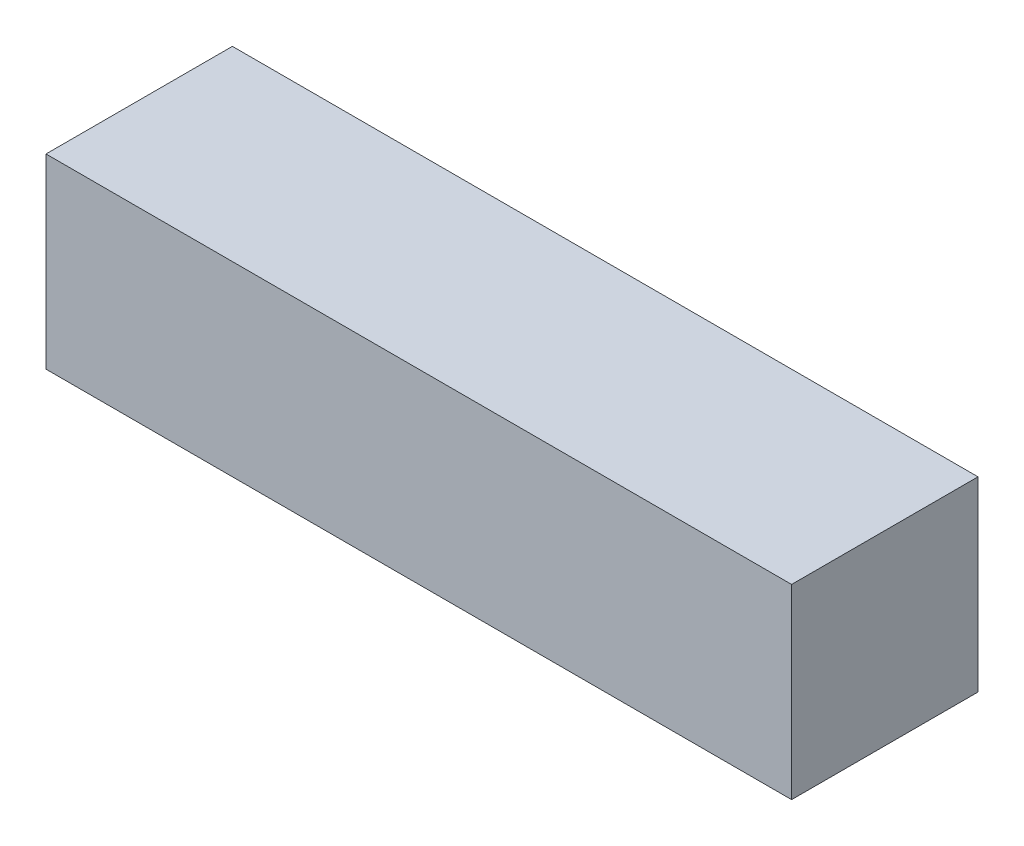
ISO-10303-21;
HEADER;
FILE_DESCRIPTION(('STEP AP214'),'2;1');
FILE_NAME('part.step','',(''),(''),'','','');
FILE_SCHEMA(('AUTOMOTIVE_DESIGN { 1 0 10303 214 1 1 1 1 }'));
ENDSEC;
DATA;
#1=APPLICATION_CONTEXT('core data for automotive mechanical design processes');
#2=APPLICATION_PROTOCOL_DEFINITION('international standard','automotive_design',2000,#1);
#3=PRODUCT_CONTEXT('',#1,'mechanical');
#4=PRODUCT('Part','Part','',(#3));
#5=PRODUCT_RELATED_PRODUCT_CATEGORY('part','',(#4));
#6=PRODUCT_DEFINITION_FORMATION('','',#4);
#7=PRODUCT_DEFINITION_CONTEXT('part definition',#1,'design');
#8=PRODUCT_DEFINITION('design','',#6,#7);
#9=PRODUCT_DEFINITION_SHAPE('','',#8);
#10=(LENGTH_UNIT() NAMED_UNIT(*) SI_UNIT(.MILLI.,.METRE.));
#11=(NAMED_UNIT(*) PLANE_ANGLE_UNIT() SI_UNIT($,.RADIAN.));
#12=(NAMED_UNIT(*) SI_UNIT($,.STERADIAN.) SOLID_ANGLE_UNIT());
#13=UNCERTAINTY_MEASURE_WITH_UNIT(LENGTH_MEASURE(1.E-05),#10,'distance_accuracy_value','');
#14=(GEOMETRIC_REPRESENTATION_CONTEXT(3) GLOBAL_UNCERTAINTY_ASSIGNED_CONTEXT((#13)) GLOBAL_UNIT_ASSIGNED_CONTEXT((#10,
#11,#12)) REPRESENTATION_CONTEXT('',''));
#15=CARTESIAN_POINT('',(0.,0.,0.));
#16=DIRECTION('',(0.,0.,1.));
#17=DIRECTION('',(1.,0.,0.));
#18=AXIS2_PLACEMENT_3D('',#15,#16,#17);
#19=CARTESIAN_POINT('',(400.,50.,50.));
#20=DIRECTION('',(0.,0.,-1.));
#21=DIRECTION('',(0.,1.,0.));
#22=AXIS2_PLACEMENT_3D('',#19,#20,#21);
#23=PLANE('',#22);
#24=DIRECTION('',(0.,-1.,0.));
#25=VECTOR('',#24,1.);
#26=CARTESIAN_POINT('',(0.,50.,50.));
#27=LINE('',#26,#25);
#28=CARTESIAN_POINT('',(0.,50.,50.));
#29=VERTEX_POINT('',#28);
#30=CARTESIAN_POINT('',(0.,-50.,50.));
#31=VERTEX_POINT('',#30);
#32=EDGE_CURVE('E99',#29,#31,#27,.T.);
#33=ORIENTED_EDGE('',*,*,#32,.T.);
#34=DIRECTION('',(-1.,0.,0.));
#35=VECTOR('',#34,1.);
#36=CARTESIAN_POINT('',(400.,-50.,50.));
#37=LINE('',#36,#35);
#38=CARTESIAN_POINT('',(400.,-50.,50.));
#39=VERTEX_POINT('',#38);
#40=EDGE_CURVE('E11',#39,#31,#37,.T.);
#41=ORIENTED_EDGE('',*,*,#40,.F.);
#42=DIRECTION('',(0.,-1.,0.));
#43=VECTOR('',#42,1.);
#44=CARTESIAN_POINT('',(400.,50.,50.));
#45=LINE('',#44,#43);
#46=CARTESIAN_POINT('',(400.,50.,50.));
#47=VERTEX_POINT('',#46);
#48=EDGE_CURVE('E87',#47,#39,#45,.T.);
#49=ORIENTED_EDGE('',*,*,#48,.F.);
#50=DIRECTION('',(-1.,0.,0.));
#51=VECTOR('',#50,1.);
#52=CARTESIAN_POINT('',(400.,50.,50.));
#53=LINE('',#52,#51);
#54=EDGE_CURVE('E95',#47,#29,#53,.T.);
#55=ORIENTED_EDGE('',*,*,#54,.T.);
#56=EDGE_LOOP('',(#33,#41,#49,#55));
#57=FACE_BOUND('',#56,.T.);
#58=ADVANCED_FACE('F36',(#57),#23,.F.);
#59=CARTESIAN_POINT('',(400.,-50.,50.));
#60=DIRECTION('',(0.,1.,0.));
#61=DIRECTION('',(0.,0.,1.));
#62=AXIS2_PLACEMENT_3D('',#59,#60,#61);
#63=PLANE('',#62);
#64=DIRECTION('',(0.,0.,-1.));
#65=VECTOR('',#64,1.);
#66=CARTESIAN_POINT('',(0.,-50.,50.));
#67=LINE('',#66,#65);
#68=CARTESIAN_POINT('',(0.,-50.,-50.));
#69=VERTEX_POINT('',#68);
#70=EDGE_CURVE('E91',#31,#69,#67,.T.);
#71=ORIENTED_EDGE('',*,*,#70,.T.);
#72=DIRECTION('',(-1.,0.,0.));
#73=VECTOR('',#72,1.);
#74=CARTESIAN_POINT('',(400.,-50.,-50.));
#75=LINE('',#74,#73);
#76=CARTESIAN_POINT('',(400.,-50.,-50.));
#77=VERTEX_POINT('',#76);
#78=EDGE_CURVE('E44',#77,#69,#75,.T.);
#79=ORIENTED_EDGE('',*,*,#78,.F.);
#80=DIRECTION('',(0.,0.,-1.));
#81=VECTOR('',#80,1.);
#82=CARTESIAN_POINT('',(400.,-50.,50.));
#83=LINE('',#82,#81);
#84=EDGE_CURVE('E82',#39,#77,#83,.T.);
#85=ORIENTED_EDGE('',*,*,#84,.F.);
#86=ORIENTED_EDGE('',*,*,#40,.T.);
#87=EDGE_LOOP('',(#71,#79,#85,#86));
#88=FACE_BOUND('',#87,.T.);
#89=ADVANCED_FACE('F90',(#88),#63,.F.);
#90=CARTESIAN_POINT('',(400.,50.,-50.));
#91=DIRECTION('',(0.,0.,1.));
#92=DIRECTION('',(0.,-1.,0.));
#93=AXIS2_PLACEMENT_3D('',#90,#91,#92);
#94=PLANE('',#93);
#95=DIRECTION('',(0.,1.,0.));
#96=VECTOR('',#95,1.);
#97=CARTESIAN_POINT('',(0.,50.,-50.));
#98=LINE('',#97,#96);
#99=CARTESIAN_POINT('',(0.,50.,-50.));
#100=VERTEX_POINT('',#99);
#101=EDGE_CURVE('E69',#69,#100,#98,.T.);
#102=ORIENTED_EDGE('',*,*,#101,.T.);
#103=DIRECTION('',(-1.,0.,0.));
#104=VECTOR('',#103,1.);
#105=CARTESIAN_POINT('',(400.,50.,-50.));
#106=LINE('',#105,#104);
#107=CARTESIAN_POINT('',(400.,50.,-50.));
#108=VERTEX_POINT('',#107);
#109=EDGE_CURVE('E92',#108,#100,#106,.T.);
#110=ORIENTED_EDGE('',*,*,#109,.F.);
#111=DIRECTION('',(0.,1.,0.));
#112=VECTOR('',#111,1.);
#113=CARTESIAN_POINT('',(400.,50.,-50.));
#114=LINE('',#113,#112);
#115=EDGE_CURVE('E85',#77,#108,#114,.T.);
#116=ORIENTED_EDGE('',*,*,#115,.F.);
#117=ORIENTED_EDGE('',*,*,#78,.T.);
#118=EDGE_LOOP('',(#102,#110,#116,#117));
#119=FACE_BOUND('',#118,.T.);
#120=ADVANCED_FACE('F93',(#119),#94,.F.);
#121=CARTESIAN_POINT('',(400.,50.,50.));
#122=DIRECTION('',(0.,-1.,0.));
#123=DIRECTION('',(0.,0.,-1.));
#124=AXIS2_PLACEMENT_3D('',#121,#122,#123);
#125=PLANE('',#124);
#126=DIRECTION('',(0.,0.,1.));
#127=VECTOR('',#126,1.);
#128=CARTESIAN_POINT('',(0.,50.,50.));
#129=LINE('',#128,#127);
#130=EDGE_CURVE('E75',#100,#29,#129,.T.);
#131=ORIENTED_EDGE('',*,*,#130,.T.);
#132=ORIENTED_EDGE('',*,*,#54,.F.);
#133=DIRECTION('',(0.,0.,1.));
#134=VECTOR('',#133,1.);
#135=CARTESIAN_POINT('',(400.,50.,50.));
#136=LINE('',#135,#134);
#137=EDGE_CURVE('E52',#108,#47,#136,.T.);
#138=ORIENTED_EDGE('',*,*,#137,.F.);
#139=ORIENTED_EDGE('',*,*,#109,.T.);
#140=EDGE_LOOP('',(#131,#132,#138,#139));
#141=FACE_BOUND('',#140,.T.);
#142=ADVANCED_FACE('F107',(#141),#125,.F.);
#143=CARTESIAN_POINT('',(400.,0.,0.));
#144=DIRECTION('',(1.,0.,0.));
#145=DIRECTION('',(0.,0.,-1.));
#146=AXIS2_PLACEMENT_3D('',#143,#144,#145);
#147=PLANE('',#146);
#148=ORIENTED_EDGE('',*,*,#48,.T.);
#149=ORIENTED_EDGE('',*,*,#84,.T.);
#150=ORIENTED_EDGE('',*,*,#115,.T.);
#151=ORIENTED_EDGE('',*,*,#137,.T.);
#152=EDGE_LOOP('',(#148,#149,#150,#151));
#153=FACE_BOUND('',#152,.T.);
#154=ADVANCED_FACE('F83',(#153),#147,.T.);
#155=CARTESIAN_POINT('',(0.,0.,0.));
#156=DIRECTION('',(1.,0.,0.));
#157=DIRECTION('',(0.,0.,-1.));
#158=AXIS2_PLACEMENT_3D('',#155,#156,#157);
#159=PLANE('',#158);
#160=CARTESIAN_POINT('',(0.,0.,0.));
#161=DIRECTION('',(-1.,0.,0.));
#162=DIRECTION('',(0.,0.,1.));
#163=AXIS2_PLACEMENT_3D('',#160,#161,#162);
#164=CIRCLE('',#163,4.);
#165=CARTESIAN_POINT('',(0.,0.,4.));
#166=VERTEX_POINT('',#165);
#167=EDGE_CURVE('E113',#166,#166,#164,.T.);
#168=ORIENTED_EDGE('',*,*,#167,.F.);
#169=EDGE_LOOP('',(#168));
#170=FACE_BOUND('',#169,.T.);
#171=ORIENTED_EDGE('',*,*,#32,.F.);
#172=ORIENTED_EDGE('',*,*,#130,.F.);
#173=ORIENTED_EDGE('',*,*,#101,.F.);
#174=ORIENTED_EDGE('',*,*,#70,.F.);
#175=EDGE_LOOP('',(#171,#172,#173,#174));
#176=FACE_BOUND('',#175,.T.);
#177=ADVANCED_FACE('F110',(#170,#176),#159,.F.);
#178=CARTESIAN_POINT('',(10.,0.,0.));
#179=DIRECTION('',(-1.,0.,0.));
#180=DIRECTION('',(0.,0.,1.));
#181=AXIS2_PLACEMENT_3D('',#178,#179,#180);
#182=CYLINDRICAL_SURFACE('',#181,4.);
#183=CARTESIAN_POINT('',(10.,0.,0.));
#184=DIRECTION('',(-1.,0.,0.));
#185=DIRECTION('',(0.,0.,1.));
#186=AXIS2_PLACEMENT_3D('',#183,#184,#185);
#187=CIRCLE('',#186,4.);
#188=CARTESIAN_POINT('',(10.,0.,4.));
#189=VERTEX_POINT('',#188);
#190=EDGE_CURVE('E102',#189,#189,#187,.T.);
#191=ORIENTED_EDGE('',*,*,#190,.F.);
#192=EDGE_LOOP('',(#191));
#193=FACE_BOUND('',#192,.T.);
#194=ORIENTED_EDGE('',*,*,#167,.T.);
#195=EDGE_LOOP('',(#194));
#196=FACE_BOUND('',#195,.T.);
#197=ADVANCED_FACE('F121',(#193,#196),#182,.F.);
#198=CARTESIAN_POINT('',(10.,0.,0.));
#199=DIRECTION('',(-1.,0.,0.));
#200=DIRECTION('',(0.,0.,1.));
#201=AXIS2_PLACEMENT_3D('',#198,#199,#200);
#202=PLANE('',#201);
#203=ORIENTED_EDGE('',*,*,#190,.T.);
#204=EDGE_LOOP('',(#203));
#205=FACE_BOUND('',#204,.T.);
#206=ADVANCED_FACE('F119',(#205),#202,.T.);
#207=CLOSED_SHELL('',(#58,#89,#120,#142,#154,#177,#197,#206));
#208=MANIFOLD_SOLID_BREP('B2',#207);
#209=ADVANCED_BREP_SHAPE_REPRESENTATION('',(#18,#208),#14);
#210=SHAPE_DEFINITION_REPRESENTATION(#9,#209);
ENDSEC;
END-ISO-10303-21;
